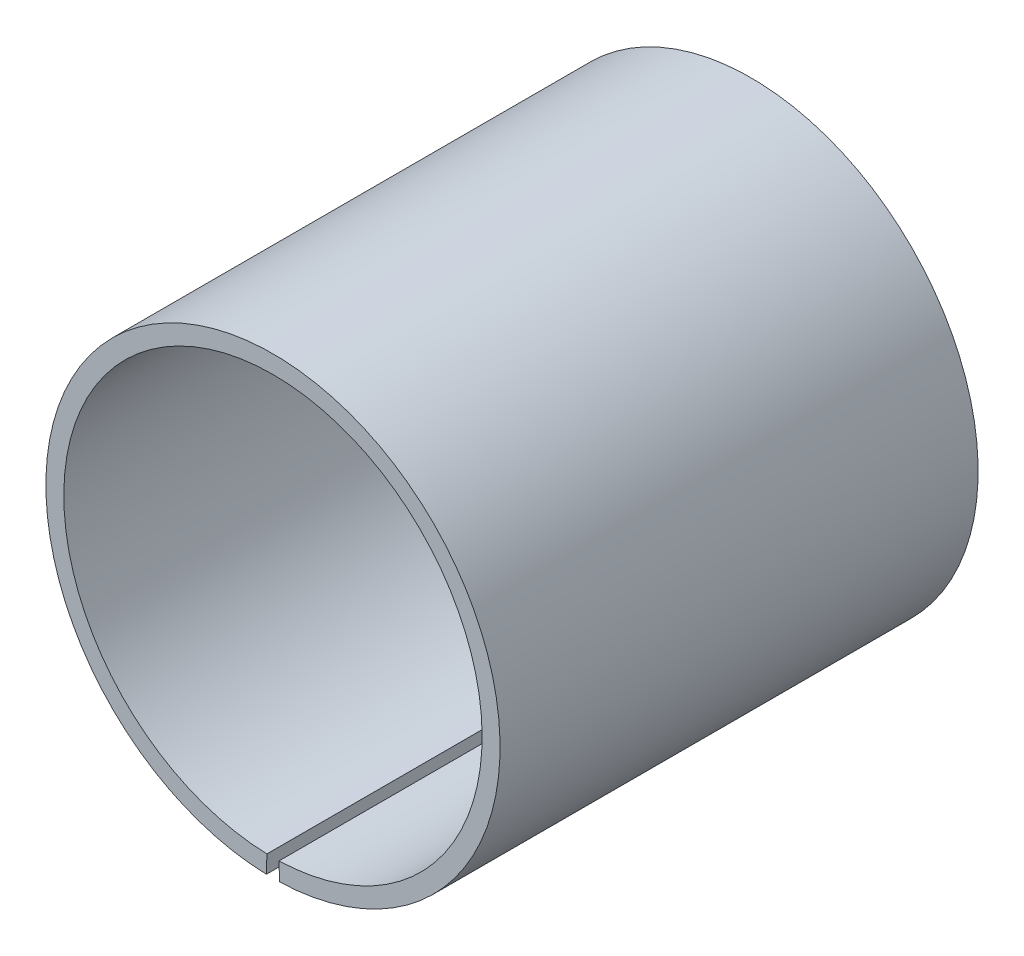
ISO-10303-21;
HEADER;
FILE_DESCRIPTION(('STEP AP214'),'2;1');
FILE_NAME('part.step','',(''),(''),'','','');
FILE_SCHEMA(('AUTOMOTIVE_DESIGN { 1 0 10303 214 1 1 1 1 }'));
ENDSEC;
DATA;
#1=APPLICATION_CONTEXT('core data for automotive mechanical design processes');
#2=APPLICATION_PROTOCOL_DEFINITION('international standard','automotive_design',2000,#1);
#3=PRODUCT_CONTEXT('',#1,'mechanical');
#4=PRODUCT('Part','Part','',(#3));
#5=PRODUCT_RELATED_PRODUCT_CATEGORY('part','',(#4));
#6=PRODUCT_DEFINITION_FORMATION('','',#4);
#7=PRODUCT_DEFINITION_CONTEXT('part definition',#1,'design');
#8=PRODUCT_DEFINITION('design','',#6,#7);
#9=PRODUCT_DEFINITION_SHAPE('','',#8);
#10=(LENGTH_UNIT() NAMED_UNIT(*) SI_UNIT(.MILLI.,.METRE.));
#11=(NAMED_UNIT(*) PLANE_ANGLE_UNIT() SI_UNIT($,.RADIAN.));
#12=(NAMED_UNIT(*) SI_UNIT($,.STERADIAN.) SOLID_ANGLE_UNIT());
#13=UNCERTAINTY_MEASURE_WITH_UNIT(LENGTH_MEASURE(1.E-05),#10,'distance_accuracy_value','');
#14=(GEOMETRIC_REPRESENTATION_CONTEXT(3) GLOBAL_UNCERTAINTY_ASSIGNED_CONTEXT((#13)) GLOBAL_UNIT_ASSIGNED_CONTEXT((#10,
#11,#12)) REPRESENTATION_CONTEXT('',''));
#15=CARTESIAN_POINT('',(0.,0.,0.));
#16=DIRECTION('',(0.,0.,1.));
#17=DIRECTION('',(1.,0.,0.));
#18=AXIS2_PLACEMENT_3D('',#15,#16,#17);
#19=CARTESIAN_POINT('',(0.,0.,40.));
#20=DIRECTION('',(0.,0.,-1.));
#21=DIRECTION('',(-1.,0.,0.));
#22=AXIS2_PLACEMENT_3D('',#19,#20,#21);
#23=CYLINDRICAL_SURFACE('',#22,17.5);
#24=CARTESIAN_POINT('',(0.,0.,0.));
#25=DIRECTION('',(0.,0.,-1.));
#26=DIRECTION('',(1.,0.,0.));
#27=AXIS2_PLACEMENT_3D('',#24,#25,#26);
#28=CIRCLE('',#27,17.5);
#29=CARTESIAN_POINT('',(-0.506756832161521,-17.4926612473076,0.));
#30=VERTEX_POINT('',#29);
#31=CARTESIAN_POINT('',(0.506756832161526,-17.4926612473076,0.));
#32=VERTEX_POINT('',#31);
#33=EDGE_CURVE('E109',#30,#32,#28,.T.);
#34=ORIENTED_EDGE('',*,*,#33,.T.);
#35=DIRECTION('',(0.,0.,-1.));
#36=VECTOR('',#35,1.);
#37=CARTESIAN_POINT('',(0.506756832161526,-17.4926612473076,40.));
#38=LINE('',#37,#36);
#39=CARTESIAN_POINT('',(0.506756832161526,-17.4926612473076,40.));
#40=VERTEX_POINT('',#39);
#41=EDGE_CURVE('E11',#40,#32,#38,.T.);
#42=ORIENTED_EDGE('',*,*,#41,.F.);
#43=CARTESIAN_POINT('',(0.,0.,40.));
#44=DIRECTION('',(0.,0.,-1.));
#45=DIRECTION('',(1.,0.,0.));
#46=AXIS2_PLACEMENT_3D('',#43,#44,#45);
#47=CIRCLE('',#46,17.5);
#48=CARTESIAN_POINT('',(-0.506756832161521,-17.4926612473076,40.));
#49=VERTEX_POINT('',#48);
#50=EDGE_CURVE('E93',#49,#40,#47,.T.);
#51=ORIENTED_EDGE('',*,*,#50,.F.);
#52=DIRECTION('',(0.,0.,-1.));
#53=VECTOR('',#52,1.);
#54=CARTESIAN_POINT('',(-0.506756832161521,-17.4926612473076,40.));
#55=LINE('',#54,#53);
#56=EDGE_CURVE('E105',#49,#30,#55,.T.);
#57=ORIENTED_EDGE('',*,*,#56,.T.);
#58=EDGE_LOOP('',(#34,#42,#51,#57));
#59=FACE_BOUND('',#58,.T.);
#60=ADVANCED_FACE('F41',(#59),#23,.F.);
#61=CARTESIAN_POINT('',(0.550193132061085,-18.9920322113626,40.));
#62=DIRECTION('',(0.999580642703292,0.0289575332663728,0.));
#63=DIRECTION('',(-0.0289575332663728,0.999580642703292,0.));
#64=AXIS2_PLACEMENT_3D('',#61,#62,#63);
#65=PLANE('',#64);
#66=DIRECTION('',(0.0289575332663728,-0.999580642703292,0.));
#67=VECTOR('',#66,1.);
#68=CARTESIAN_POINT('',(0.550193132061085,-18.9920322113626,0.));
#69=LINE('',#68,#67);
#70=CARTESIAN_POINT('',(0.550193132061082,-18.9920322113626,0.));
#71=VERTEX_POINT('',#70);
#72=EDGE_CURVE('E98',#32,#71,#69,.T.);
#73=ORIENTED_EDGE('',*,*,#72,.T.);
#74=DIRECTION('',(0.,0.,-1.));
#75=VECTOR('',#74,1.);
#76=CARTESIAN_POINT('',(0.550193132061082,-18.9920322113626,40.));
#77=LINE('',#76,#75);
#78=CARTESIAN_POINT('',(0.550193132061082,-18.9920322113626,40.));
#79=VERTEX_POINT('',#78);
#80=EDGE_CURVE('E50',#79,#71,#77,.T.);
#81=ORIENTED_EDGE('',*,*,#80,.F.);
#82=DIRECTION('',(0.0289575332663728,-0.999580642703292,0.));
#83=VECTOR('',#82,1.);
#84=CARTESIAN_POINT('',(0.550193132061085,-18.9920322113626,40.));
#85=LINE('',#84,#83);
#86=EDGE_CURVE('E88',#40,#79,#85,.T.);
#87=ORIENTED_EDGE('',*,*,#86,.F.);
#88=ORIENTED_EDGE('',*,*,#41,.T.);
#89=EDGE_LOOP('',(#73,#81,#87,#88));
#90=FACE_BOUND('',#89,.T.);
#91=ADVANCED_FACE('F97',(#90),#65,.F.);
#92=CARTESIAN_POINT('',(0.,0.,40.));
#93=DIRECTION('',(0.,0.,-1.));
#94=DIRECTION('',(-1.,0.,0.));
#95=AXIS2_PLACEMENT_3D('',#92,#93,#94);
#96=CYLINDRICAL_SURFACE('',#95,19.);
#97=CARTESIAN_POINT('',(0.,0.,0.));
#98=DIRECTION('',(0.,0.,1.));
#99=DIRECTION('',(1.,0.,0.));
#100=AXIS2_PLACEMENT_3D('',#97,#98,#99);
#101=CIRCLE('',#100,19.);
#102=CARTESIAN_POINT('',(-0.55019313206108,-18.9920322113626,0.));
#103=VERTEX_POINT('',#102);
#104=EDGE_CURVE('E75',#71,#103,#101,.T.);
#105=ORIENTED_EDGE('',*,*,#104,.T.);
#106=DIRECTION('',(0.,0.,-1.));
#107=VECTOR('',#106,1.);
#108=CARTESIAN_POINT('',(-0.55019313206108,-18.9920322113626,40.));
#109=LINE('',#108,#107);
#110=CARTESIAN_POINT('',(-0.55019313206108,-18.9920322113626,40.));
#111=VERTEX_POINT('',#110);
#112=EDGE_CURVE('E100',#111,#103,#109,.T.);
#113=ORIENTED_EDGE('',*,*,#112,.F.);
#114=CARTESIAN_POINT('',(0.,0.,40.));
#115=DIRECTION('',(0.,0.,1.));
#116=DIRECTION('',(1.,0.,0.));
#117=AXIS2_PLACEMENT_3D('',#114,#115,#116);
#118=CIRCLE('',#117,19.);
#119=EDGE_CURVE('E91',#79,#111,#118,.T.);
#120=ORIENTED_EDGE('',*,*,#119,.F.);
#121=ORIENTED_EDGE('',*,*,#80,.T.);
#122=EDGE_LOOP('',(#105,#113,#120,#121));
#123=FACE_BOUND('',#122,.T.);
#124=ADVANCED_FACE('F101',(#123),#96,.T.);
#125=CARTESIAN_POINT('',(-0.506756832161521,-17.4926612473076,40.));
#126=DIRECTION('',(-0.999580642703292,0.0289575332663727,0.));
#127=DIRECTION('',(-0.0289575332663727,-0.999580642703292,0.));
#128=AXIS2_PLACEMENT_3D('',#125,#126,#127);
#129=PLANE('',#128);
#130=DIRECTION('',(0.0289575332663727,0.999580642703292,0.));
#131=VECTOR('',#130,1.);
#132=CARTESIAN_POINT('',(-0.506756832161521,-17.4926612473076,0.));
#133=LINE('',#132,#131);
#134=EDGE_CURVE('E81',#103,#30,#133,.T.);
#135=ORIENTED_EDGE('',*,*,#134,.T.);
#136=ORIENTED_EDGE('',*,*,#56,.F.);
#137=DIRECTION('',(0.0289575332663727,0.999580642703292,0.));
#138=VECTOR('',#137,1.);
#139=CARTESIAN_POINT('',(-0.506756832161521,-17.4926612473076,40.));
#140=LINE('',#139,#138);
#141=EDGE_CURVE('E58',#111,#49,#140,.T.);
#142=ORIENTED_EDGE('',*,*,#141,.F.);
#143=ORIENTED_EDGE('',*,*,#112,.T.);
#144=EDGE_LOOP('',(#135,#136,#142,#143));
#145=FACE_BOUND('',#144,.T.);
#146=ADVANCED_FACE('F122',(#145),#129,.F.);
#147=CARTESIAN_POINT('',(0.,0.,40.));
#148=DIRECTION('',(0.,0.,1.));
#149=DIRECTION('',(1.,0.,0.));
#150=AXIS2_PLACEMENT_3D('',#147,#148,#149);
#151=PLANE('',#150);
#152=ORIENTED_EDGE('',*,*,#50,.T.);
#153=ORIENTED_EDGE('',*,*,#86,.T.);
#154=ORIENTED_EDGE('',*,*,#119,.T.);
#155=ORIENTED_EDGE('',*,*,#141,.T.);
#156=EDGE_LOOP('',(#152,#153,#154,#155));
#157=FACE_BOUND('',#156,.T.);
#158=ADVANCED_FACE('F89',(#157),#151,.T.);
#159=CARTESIAN_POINT('',(0.,0.,0.));
#160=DIRECTION('',(0.,0.,1.));
#161=DIRECTION('',(1.,0.,0.));
#162=AXIS2_PLACEMENT_3D('',#159,#160,#161);
#163=PLANE('',#162);
#164=ORIENTED_EDGE('',*,*,#33,.F.);
#165=ORIENTED_EDGE('',*,*,#134,.F.);
#166=ORIENTED_EDGE('',*,*,#104,.F.);
#167=ORIENTED_EDGE('',*,*,#72,.F.);
#168=EDGE_LOOP('',(#164,#165,#166,#167));
#169=FACE_BOUND('',#168,.T.);
#170=ADVANCED_FACE('F125',(#169),#163,.F.);
#171=CLOSED_SHELL('',(#60,#91,#124,#146,#158,#170));
#172=MANIFOLD_SOLID_BREP('B2',#171);
#173=ADVANCED_BREP_SHAPE_REPRESENTATION('',(#18,#172),#14);
#174=SHAPE_DEFINITION_REPRESENTATION(#9,#173);
ENDSEC;
END-ISO-10303-21;
